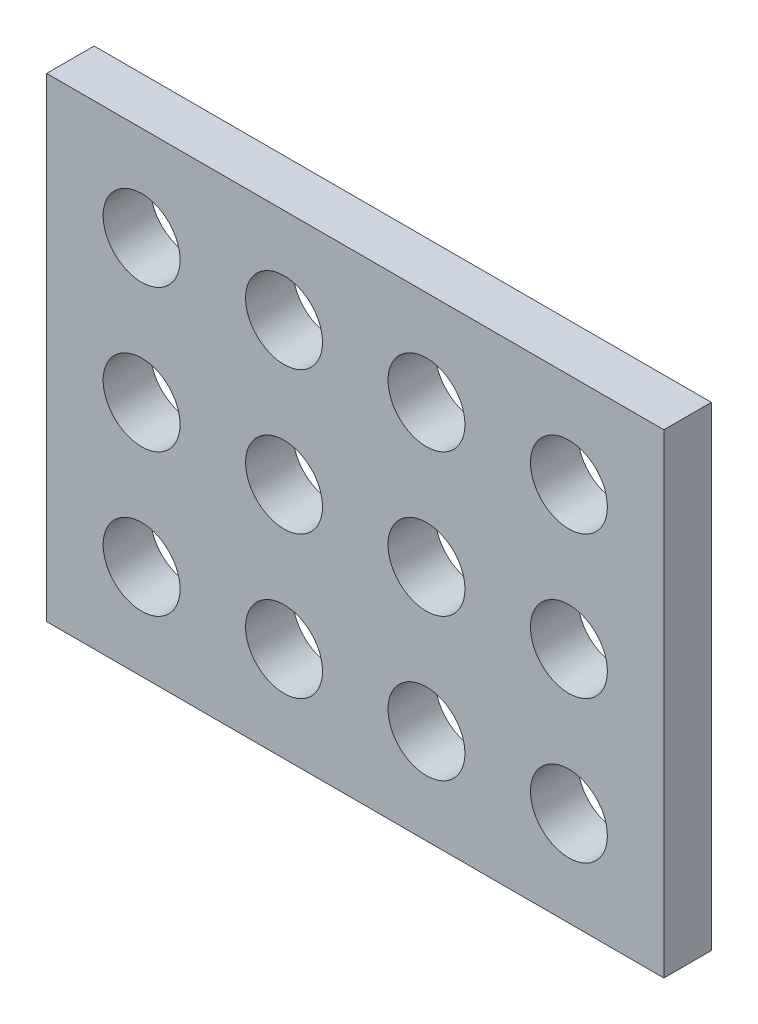
ISO-10303-21;
HEADER;
FILE_DESCRIPTION(('STEP AP214'),'2;1');
FILE_NAME('part.step','',(''),(''),'','','');
FILE_SCHEMA(('AUTOMOTIVE_DESIGN { 1 0 10303 214 1 1 1 1 }'));
ENDSEC;
DATA;
#1=APPLICATION_CONTEXT('core data for automotive mechanical design processes');
#2=APPLICATION_PROTOCOL_DEFINITION('international standard','automotive_design',2000,#1);
#3=PRODUCT_CONTEXT('',#1,'mechanical');
#4=PRODUCT('Part','Part','',(#3));
#5=PRODUCT_RELATED_PRODUCT_CATEGORY('part','',(#4));
#6=PRODUCT_DEFINITION_FORMATION('','',#4);
#7=PRODUCT_DEFINITION_CONTEXT('part definition',#1,'design');
#8=PRODUCT_DEFINITION('design','',#6,#7);
#9=PRODUCT_DEFINITION_SHAPE('','',#8);
#10=(LENGTH_UNIT() NAMED_UNIT(*) SI_UNIT(.MILLI.,.METRE.));
#11=(NAMED_UNIT(*) PLANE_ANGLE_UNIT() SI_UNIT($,.RADIAN.));
#12=(NAMED_UNIT(*) SI_UNIT($,.STERADIAN.) SOLID_ANGLE_UNIT());
#13=UNCERTAINTY_MEASURE_WITH_UNIT(LENGTH_MEASURE(1.E-05),#10,'distance_accuracy_value','');
#14=(GEOMETRIC_REPRESENTATION_CONTEXT(3) GLOBAL_UNCERTAINTY_ASSIGNED_CONTEXT((#13)) GLOBAL_UNIT_ASSIGNED_CONTEXT((#10,
#11,#12)) REPRESENTATION_CONTEXT('',''));
#15=CARTESIAN_POINT('',(0.,0.,0.));
#16=DIRECTION('',(0.,0.,1.));
#17=DIRECTION('',(1.,0.,0.));
#18=AXIS2_PLACEMENT_3D('',#15,#16,#17);
#19=CARTESIAN_POINT('',(0.,0.,10.));
#20=DIRECTION('',(0.,0.,-1.));
#21=DIRECTION('',(-1.,0.,0.));
#22=AXIS2_PLACEMENT_3D('',#19,#20,#21);
#23=PLANE('',#22);
#24=CARTESIAN_POINT('',(-44.9999999999997,0.,10.));
#25=DIRECTION('',(0.,0.,1.));
#26=DIRECTION('',(1.,0.,0.));
#27=AXIS2_PLACEMENT_3D('',#24,#25,#26);
#28=CIRCLE('',#27,8.1);
#29=CARTESIAN_POINT('',(-36.8999999999997,0.,10.));
#30=VERTEX_POINT('',#29);
#31=EDGE_CURVE('E168',#30,#30,#28,.T.);
#32=ORIENTED_EDGE('',*,*,#31,.F.);
#33=EDGE_LOOP('',(#32));
#34=FACE_BOUND('',#33,.T.);
#35=CARTESIAN_POINT('',(15.0000000000006,-30.,10.));
#36=DIRECTION('',(0.,0.,1.));
#37=DIRECTION('',(1.,0.,0.));
#38=AXIS2_PLACEMENT_3D('',#35,#36,#37);
#39=CIRCLE('',#38,8.09999999999999);
#40=CARTESIAN_POINT('',(23.1000000000006,-30.,10.));
#41=VERTEX_POINT('',#40);
#42=EDGE_CURVE('E156',#41,#41,#39,.T.);
#43=ORIENTED_EDGE('',*,*,#42,.F.);
#44=EDGE_LOOP('',(#43));
#45=FACE_BOUND('',#44,.T.);
#46=CARTESIAN_POINT('',(45.0000000000003,0.,10.));
#47=DIRECTION('',(0.,0.,1.));
#48=DIRECTION('',(1.,0.,0.));
#49=AXIS2_PLACEMENT_3D('',#46,#47,#48);
#50=CIRCLE('',#49,8.1);
#51=CARTESIAN_POINT('',(53.1000000000003,0.,10.));
#52=VERTEX_POINT('',#51);
#53=EDGE_CURVE('E144',#52,#52,#50,.T.);
#54=ORIENTED_EDGE('',*,*,#53,.F.);
#55=EDGE_LOOP('',(#54));
#56=FACE_BOUND('',#55,.T.);
#57=CARTESIAN_POINT('',(-14.9999999999997,0.,10.));
#58=DIRECTION('',(0.,0.,1.));
#59=DIRECTION('',(1.,0.,0.));
#60=AXIS2_PLACEMENT_3D('',#57,#58,#59);
#61=CIRCLE('',#60,8.09999999999999);
#62=CARTESIAN_POINT('',(-6.89999999999968,0.,10.));
#63=VERTEX_POINT('',#62);
#64=EDGE_CURVE('E132',#63,#63,#61,.T.);
#65=ORIENTED_EDGE('',*,*,#64,.F.);
#66=EDGE_LOOP('',(#65));
#67=FACE_BOUND('',#66,.T.);
#68=CARTESIAN_POINT('',(15.,30.,10.));
#69=DIRECTION('',(0.,0.,1.));
#70=DIRECTION('',(1.,0.,0.));
#71=AXIS2_PLACEMENT_3D('',#68,#69,#70);
#72=CIRCLE('',#71,8.09999999999999);
#73=CARTESIAN_POINT('',(23.1,30.,10.));
#74=VERTEX_POINT('',#73);
#75=EDGE_CURVE('E120',#74,#74,#72,.T.);
#76=ORIENTED_EDGE('',*,*,#75,.F.);
#77=EDGE_LOOP('',(#76));
#78=FACE_BOUND('',#77,.T.);
#79=CARTESIAN_POINT('',(-45.,30.,10.));
#80=DIRECTION('',(0.,0.,1.));
#81=DIRECTION('',(1.,0.,0.));
#82=AXIS2_PLACEMENT_3D('',#79,#80,#81);
#83=CIRCLE('',#82,8.1);
#84=CARTESIAN_POINT('',(-36.9,30.,10.));
#85=VERTEX_POINT('',#84);
#86=EDGE_CURVE('E99',#85,#85,#83,.T.);
#87=ORIENTED_EDGE('',*,*,#86,.F.);
#88=EDGE_LOOP('',(#87));
#89=FACE_BOUND('',#88,.T.);
#90=DIRECTION('',(0.,1.,0.));
#91=VECTOR('',#90,1.);
#92=CARTESIAN_POINT('',(65.,-50.,10.));
#93=LINE('',#92,#91);
#94=CARTESIAN_POINT('',(65.,-50.,10.));
#95=VERTEX_POINT('',#94);
#96=CARTESIAN_POINT('',(65.,50.,10.));
#97=VERTEX_POINT('',#96);
#98=EDGE_CURVE('E84',#95,#97,#93,.T.);
#99=ORIENTED_EDGE('',*,*,#98,.T.);
#100=DIRECTION('',(-1.,0.,0.));
#101=VECTOR('',#100,1.);
#102=CARTESIAN_POINT('',(-65.,50.,10.));
#103=LINE('',#102,#101);
#104=CARTESIAN_POINT('',(-65.,50.,10.));
#105=VERTEX_POINT('',#104);
#106=EDGE_CURVE('E79',#97,#105,#103,.T.);
#107=ORIENTED_EDGE('',*,*,#106,.T.);
#108=DIRECTION('',(0.,-1.,0.));
#109=VECTOR('',#108,1.);
#110=CARTESIAN_POINT('',(-65.,-50.,10.));
#111=LINE('',#110,#109);
#112=CARTESIAN_POINT('',(-65.,-50.,10.));
#113=VERTEX_POINT('',#112);
#114=EDGE_CURVE('E82',#105,#113,#111,.T.);
#115=ORIENTED_EDGE('',*,*,#114,.T.);
#116=DIRECTION('',(1.,0.,0.));
#117=VECTOR('',#116,1.);
#118=CARTESIAN_POINT('',(-65.,-50.,10.));
#119=LINE('',#118,#117);
#120=EDGE_CURVE('E49',#113,#95,#119,.T.);
#121=ORIENTED_EDGE('',*,*,#120,.T.);
#122=EDGE_LOOP('',(#99,#107,#115,#121));
#123=FACE_BOUND('',#122,.T.);
#124=CARTESIAN_POINT('',(-15.,30.,10.));
#125=DIRECTION('',(0.,0.,1.));
#126=DIRECTION('',(1.,0.,0.));
#127=AXIS2_PLACEMENT_3D('',#124,#125,#126);
#128=CIRCLE('',#127,8.1);
#129=CARTESIAN_POINT('',(-6.89999999999999,30.,10.));
#130=VERTEX_POINT('',#129);
#131=EDGE_CURVE('E114',#130,#130,#128,.T.);
#132=ORIENTED_EDGE('',*,*,#131,.F.);
#133=EDGE_LOOP('',(#132));
#134=FACE_BOUND('',#133,.T.);
#135=CARTESIAN_POINT('',(45.,30.,10.));
#136=DIRECTION('',(0.,0.,1.));
#137=DIRECTION('',(1.,0.,0.));
#138=AXIS2_PLACEMENT_3D('',#135,#136,#137);
#139=CIRCLE('',#138,8.1);
#140=CARTESIAN_POINT('',(53.1,30.,10.));
#141=VERTEX_POINT('',#140);
#142=EDGE_CURVE('E126',#141,#141,#139,.T.);
#143=ORIENTED_EDGE('',*,*,#142,.F.);
#144=EDGE_LOOP('',(#143));
#145=FACE_BOUND('',#144,.T.);
#146=CARTESIAN_POINT('',(15.0000000000003,0.,10.));
#147=DIRECTION('',(0.,0.,1.));
#148=DIRECTION('',(1.,0.,0.));
#149=AXIS2_PLACEMENT_3D('',#146,#147,#148);
#150=CIRCLE('',#149,8.09999999999999);
#151=CARTESIAN_POINT('',(23.1000000000003,0.,10.));
#152=VERTEX_POINT('',#151);
#153=EDGE_CURVE('E138',#152,#152,#150,.T.);
#154=ORIENTED_EDGE('',*,*,#153,.F.);
#155=EDGE_LOOP('',(#154));
#156=FACE_BOUND('',#155,.T.);
#157=CARTESIAN_POINT('',(-14.9999999999994,-30.,10.));
#158=DIRECTION('',(0.,0.,1.));
#159=DIRECTION('',(1.,0.,0.));
#160=AXIS2_PLACEMENT_3D('',#157,#158,#159);
#161=CIRCLE('',#160,8.09999999999999);
#162=CARTESIAN_POINT('',(-6.89999999999937,-30.,10.));
#163=VERTEX_POINT('',#162);
#164=EDGE_CURVE('E150',#163,#163,#161,.T.);
#165=ORIENTED_EDGE('',*,*,#164,.F.);
#166=EDGE_LOOP('',(#165));
#167=FACE_BOUND('',#166,.T.);
#168=CARTESIAN_POINT('',(45.0000000000006,-30.,10.));
#169=DIRECTION('',(0.,0.,1.));
#170=DIRECTION('',(1.,0.,0.));
#171=AXIS2_PLACEMENT_3D('',#168,#169,#170);
#172=CIRCLE('',#171,8.1);
#173=CARTESIAN_POINT('',(53.1000000000006,-30.,10.));
#174=VERTEX_POINT('',#173);
#175=EDGE_CURVE('E162',#174,#174,#172,.T.);
#176=ORIENTED_EDGE('',*,*,#175,.F.);
#177=EDGE_LOOP('',(#176));
#178=FACE_BOUND('',#177,.T.);
#179=CARTESIAN_POINT('',(-44.9999999999994,-30.,10.));
#180=DIRECTION('',(0.,0.,1.));
#181=DIRECTION('',(1.,0.,0.));
#182=AXIS2_PLACEMENT_3D('',#179,#180,#181);
#183=CIRCLE('',#182,8.1);
#184=CARTESIAN_POINT('',(-36.8999999999994,-30.,10.));
#185=VERTEX_POINT('',#184);
#186=EDGE_CURVE('E174',#185,#185,#183,.T.);
#187=ORIENTED_EDGE('',*,*,#186,.F.);
#188=EDGE_LOOP('',(#187));
#189=FACE_BOUND('',#188,.T.);
#190=ADVANCED_FACE('F32',(#34,#45,#56,#67,#78,#89,#123,#134,#145,#156,#167,#178,#189),#23,.F.);
#191=CARTESIAN_POINT('',(0.,0.,0.));
#192=DIRECTION('',(0.,0.,-1.));
#193=DIRECTION('',(-1.,0.,0.));
#194=AXIS2_PLACEMENT_3D('',#191,#192,#193);
#195=PLANE('',#194);
#196=CARTESIAN_POINT('',(-44.9999999999997,0.,0.));
#197=DIRECTION('',(0.,0.,1.));
#198=DIRECTION('',(1.,0.,0.));
#199=AXIS2_PLACEMENT_3D('',#196,#197,#198);
#200=CIRCLE('',#199,8.1);
#201=CARTESIAN_POINT('',(-36.8999999999997,0.,0.));
#202=VERTEX_POINT('',#201);
#203=EDGE_CURVE('E171',#202,#202,#200,.T.);
#204=ORIENTED_EDGE('',*,*,#203,.T.);
#205=EDGE_LOOP('',(#204));
#206=FACE_BOUND('',#205,.T.);
#207=CARTESIAN_POINT('',(15.0000000000006,-30.,0.));
#208=DIRECTION('',(0.,0.,1.));
#209=DIRECTION('',(1.,0.,0.));
#210=AXIS2_PLACEMENT_3D('',#207,#208,#209);
#211=CIRCLE('',#210,8.09999999999999);
#212=CARTESIAN_POINT('',(23.1000000000006,-30.,0.));
#213=VERTEX_POINT('',#212);
#214=EDGE_CURVE('E159',#213,#213,#211,.T.);
#215=ORIENTED_EDGE('',*,*,#214,.T.);
#216=EDGE_LOOP('',(#215));
#217=FACE_BOUND('',#216,.T.);
#218=CARTESIAN_POINT('',(45.0000000000003,0.,0.));
#219=DIRECTION('',(0.,0.,1.));
#220=DIRECTION('',(1.,0.,0.));
#221=AXIS2_PLACEMENT_3D('',#218,#219,#220);
#222=CIRCLE('',#221,8.1);
#223=CARTESIAN_POINT('',(53.1000000000003,0.,0.));
#224=VERTEX_POINT('',#223);
#225=EDGE_CURVE('E147',#224,#224,#222,.T.);
#226=ORIENTED_EDGE('',*,*,#225,.T.);
#227=EDGE_LOOP('',(#226));
#228=FACE_BOUND('',#227,.T.);
#229=CARTESIAN_POINT('',(-14.9999999999997,0.,0.));
#230=DIRECTION('',(0.,0.,1.));
#231=DIRECTION('',(1.,0.,0.));
#232=AXIS2_PLACEMENT_3D('',#229,#230,#231);
#233=CIRCLE('',#232,8.09999999999999);
#234=CARTESIAN_POINT('',(-6.89999999999968,0.,0.));
#235=VERTEX_POINT('',#234);
#236=EDGE_CURVE('E135',#235,#235,#233,.T.);
#237=ORIENTED_EDGE('',*,*,#236,.T.);
#238=EDGE_LOOP('',(#237));
#239=FACE_BOUND('',#238,.T.);
#240=CARTESIAN_POINT('',(15.,30.,0.));
#241=DIRECTION('',(0.,0.,1.));
#242=DIRECTION('',(1.,0.,0.));
#243=AXIS2_PLACEMENT_3D('',#240,#241,#242);
#244=CIRCLE('',#243,8.09999999999999);
#245=CARTESIAN_POINT('',(23.1,30.,0.));
#246=VERTEX_POINT('',#245);
#247=EDGE_CURVE('E123',#246,#246,#244,.T.);
#248=ORIENTED_EDGE('',*,*,#247,.T.);
#249=EDGE_LOOP('',(#248));
#250=FACE_BOUND('',#249,.T.);
#251=CARTESIAN_POINT('',(-45.,30.,0.));
#252=DIRECTION('',(0.,0.,1.));
#253=DIRECTION('',(1.,0.,0.));
#254=AXIS2_PLACEMENT_3D('',#251,#252,#253);
#255=CIRCLE('',#254,8.1);
#256=CARTESIAN_POINT('',(-36.9,30.,0.));
#257=VERTEX_POINT('',#256);
#258=EDGE_CURVE('E111',#257,#257,#255,.T.);
#259=ORIENTED_EDGE('',*,*,#258,.T.);
#260=EDGE_LOOP('',(#259));
#261=FACE_BOUND('',#260,.T.);
#262=DIRECTION('',(0.,1.,0.));
#263=VECTOR('',#262,1.);
#264=CARTESIAN_POINT('',(65.,-50.,0.));
#265=LINE('',#264,#263);
#266=CARTESIAN_POINT('',(65.,-50.,0.));
#267=VERTEX_POINT('',#266);
#268=CARTESIAN_POINT('',(65.,50.,0.));
#269=VERTEX_POINT('',#268);
#270=EDGE_CURVE('E96',#267,#269,#265,.T.);
#271=ORIENTED_EDGE('',*,*,#270,.F.);
#272=DIRECTION('',(1.,0.,0.));
#273=VECTOR('',#272,1.);
#274=CARTESIAN_POINT('',(-65.,-50.,0.));
#275=LINE('',#274,#273);
#276=CARTESIAN_POINT('',(-65.,-50.,0.));
#277=VERTEX_POINT('',#276);
#278=EDGE_CURVE('E72',#277,#267,#275,.T.);
#279=ORIENTED_EDGE('',*,*,#278,.F.);
#280=DIRECTION('',(0.,-1.,0.));
#281=VECTOR('',#280,1.);
#282=CARTESIAN_POINT('',(-65.,-50.,0.));
#283=LINE('',#282,#281);
#284=CARTESIAN_POINT('',(-65.,50.,0.));
#285=VERTEX_POINT('',#284);
#286=EDGE_CURVE('E66',#285,#277,#283,.T.);
#287=ORIENTED_EDGE('',*,*,#286,.F.);
#288=DIRECTION('',(-1.,0.,0.));
#289=VECTOR('',#288,1.);
#290=CARTESIAN_POINT('',(-65.,50.,0.));
#291=LINE('',#290,#289);
#292=EDGE_CURVE('E88',#269,#285,#291,.T.);
#293=ORIENTED_EDGE('',*,*,#292,.F.);
#294=EDGE_LOOP('',(#271,#279,#287,#293));
#295=FACE_BOUND('',#294,.T.);
#296=CARTESIAN_POINT('',(-15.,30.,0.));
#297=DIRECTION('',(0.,0.,1.));
#298=DIRECTION('',(1.,0.,0.));
#299=AXIS2_PLACEMENT_3D('',#296,#297,#298);
#300=CIRCLE('',#299,8.1);
#301=CARTESIAN_POINT('',(-6.89999999999999,30.,0.));
#302=VERTEX_POINT('',#301);
#303=EDGE_CURVE('E117',#302,#302,#300,.T.);
#304=ORIENTED_EDGE('',*,*,#303,.T.);
#305=EDGE_LOOP('',(#304));
#306=FACE_BOUND('',#305,.T.);
#307=CARTESIAN_POINT('',(45.,30.,0.));
#308=DIRECTION('',(0.,0.,1.));
#309=DIRECTION('',(1.,0.,0.));
#310=AXIS2_PLACEMENT_3D('',#307,#308,#309);
#311=CIRCLE('',#310,8.1);
#312=CARTESIAN_POINT('',(53.1,30.,0.));
#313=VERTEX_POINT('',#312);
#314=EDGE_CURVE('E129',#313,#313,#311,.T.);
#315=ORIENTED_EDGE('',*,*,#314,.T.);
#316=EDGE_LOOP('',(#315));
#317=FACE_BOUND('',#316,.T.);
#318=CARTESIAN_POINT('',(15.0000000000003,0.,0.));
#319=DIRECTION('',(0.,0.,1.));
#320=DIRECTION('',(1.,0.,0.));
#321=AXIS2_PLACEMENT_3D('',#318,#319,#320);
#322=CIRCLE('',#321,8.09999999999999);
#323=CARTESIAN_POINT('',(23.1000000000003,0.,0.));
#324=VERTEX_POINT('',#323);
#325=EDGE_CURVE('E141',#324,#324,#322,.T.);
#326=ORIENTED_EDGE('',*,*,#325,.T.);
#327=EDGE_LOOP('',(#326));
#328=FACE_BOUND('',#327,.T.);
#329=CARTESIAN_POINT('',(-14.9999999999994,-30.,0.));
#330=DIRECTION('',(0.,0.,1.));
#331=DIRECTION('',(1.,0.,0.));
#332=AXIS2_PLACEMENT_3D('',#329,#330,#331);
#333=CIRCLE('',#332,8.09999999999999);
#334=CARTESIAN_POINT('',(-6.89999999999937,-30.,0.));
#335=VERTEX_POINT('',#334);
#336=EDGE_CURVE('E153',#335,#335,#333,.T.);
#337=ORIENTED_EDGE('',*,*,#336,.T.);
#338=EDGE_LOOP('',(#337));
#339=FACE_BOUND('',#338,.T.);
#340=CARTESIAN_POINT('',(45.0000000000006,-30.,0.));
#341=DIRECTION('',(0.,0.,1.));
#342=DIRECTION('',(1.,0.,0.));
#343=AXIS2_PLACEMENT_3D('',#340,#341,#342);
#344=CIRCLE('',#343,8.1);
#345=CARTESIAN_POINT('',(53.1000000000006,-30.,0.));
#346=VERTEX_POINT('',#345);
#347=EDGE_CURVE('E165',#346,#346,#344,.T.);
#348=ORIENTED_EDGE('',*,*,#347,.T.);
#349=EDGE_LOOP('',(#348));
#350=FACE_BOUND('',#349,.T.);
#351=CARTESIAN_POINT('',(-44.9999999999994,-30.,0.));
#352=DIRECTION('',(0.,0.,1.));
#353=DIRECTION('',(1.,0.,0.));
#354=AXIS2_PLACEMENT_3D('',#351,#352,#353);
#355=CIRCLE('',#354,8.1);
#356=CARTESIAN_POINT('',(-36.8999999999994,-30.,0.));
#357=VERTEX_POINT('',#356);
#358=EDGE_CURVE('E177',#357,#357,#355,.T.);
#359=ORIENTED_EDGE('',*,*,#358,.T.);
#360=EDGE_LOOP('',(#359));
#361=FACE_BOUND('',#360,.T.);
#362=ADVANCED_FACE('F107',(#206,#217,#228,#239,#250,#261,#295,#306,#317,#328,#339,#350,#361),
#195,.T.);
#363=CARTESIAN_POINT('',(65.,-50.,10.));
#364=DIRECTION('',(-1.,0.,0.));
#365=DIRECTION('',(0.,0.,1.));
#366=AXIS2_PLACEMENT_3D('',#363,#364,#365);
#367=PLANE('',#366);
#368=ORIENTED_EDGE('',*,*,#270,.T.);
#369=DIRECTION('',(0.,0.,-1.));
#370=VECTOR('',#369,1.);
#371=CARTESIAN_POINT('',(65.,50.,10.));
#372=LINE('',#371,#370);
#373=EDGE_CURVE('E11',#97,#269,#372,.T.);
#374=ORIENTED_EDGE('',*,*,#373,.F.);
#375=ORIENTED_EDGE('',*,*,#98,.F.);
#376=DIRECTION('',(0.,0.,-1.));
#377=VECTOR('',#376,1.);
#378=CARTESIAN_POINT('',(65.,-50.,10.));
#379=LINE('',#378,#377);
#380=EDGE_CURVE('E92',#95,#267,#379,.T.);
#381=ORIENTED_EDGE('',*,*,#380,.T.);
#382=EDGE_LOOP('',(#368,#374,#375,#381));
#383=FACE_BOUND('',#382,.T.);
#384=ADVANCED_FACE('F34',(#383),#367,.F.);
#385=CARTESIAN_POINT('',(-65.,50.,10.));
#386=DIRECTION('',(0.,-1.,0.));
#387=DIRECTION('',(0.,0.,-1.));
#388=AXIS2_PLACEMENT_3D('',#385,#386,#387);
#389=PLANE('',#388);
#390=ORIENTED_EDGE('',*,*,#292,.T.);
#391=DIRECTION('',(0.,0.,-1.));
#392=VECTOR('',#391,1.);
#393=CARTESIAN_POINT('',(-65.,50.,10.));
#394=LINE('',#393,#392);
#395=EDGE_CURVE('E41',#105,#285,#394,.T.);
#396=ORIENTED_EDGE('',*,*,#395,.F.);
#397=ORIENTED_EDGE('',*,*,#106,.F.);
#398=ORIENTED_EDGE('',*,*,#373,.T.);
#399=EDGE_LOOP('',(#390,#396,#397,#398));
#400=FACE_BOUND('',#399,.T.);
#401=ADVANCED_FACE('F87',(#400),#389,.F.);
#402=CARTESIAN_POINT('',(-65.,-50.,10.));
#403=DIRECTION('',(1.,0.,0.));
#404=DIRECTION('',(0.,0.,-1.));
#405=AXIS2_PLACEMENT_3D('',#402,#403,#404);
#406=PLANE('',#405);
#407=ORIENTED_EDGE('',*,*,#286,.T.);
#408=DIRECTION('',(0.,0.,-1.));
#409=VECTOR('',#408,1.);
#410=CARTESIAN_POINT('',(-65.,-50.,10.));
#411=LINE('',#410,#409);
#412=EDGE_CURVE('E89',#113,#277,#411,.T.);
#413=ORIENTED_EDGE('',*,*,#412,.F.);
#414=ORIENTED_EDGE('',*,*,#114,.F.);
#415=ORIENTED_EDGE('',*,*,#395,.T.);
#416=EDGE_LOOP('',(#407,#413,#414,#415));
#417=FACE_BOUND('',#416,.T.);
#418=ADVANCED_FACE('F90',(#417),#406,.F.);
#419=CARTESIAN_POINT('',(-65.,-50.,10.));
#420=DIRECTION('',(0.,1.,0.));
#421=DIRECTION('',(0.,0.,1.));
#422=AXIS2_PLACEMENT_3D('',#419,#420,#421);
#423=PLANE('',#422);
#424=ORIENTED_EDGE('',*,*,#278,.T.);
#425=ORIENTED_EDGE('',*,*,#380,.F.);
#426=ORIENTED_EDGE('',*,*,#120,.F.);
#427=ORIENTED_EDGE('',*,*,#412,.T.);
#428=EDGE_LOOP('',(#424,#425,#426,#427));
#429=FACE_BOUND('',#428,.T.);
#430=ADVANCED_FACE('F104',(#429),#423,.F.);
#431=CARTESIAN_POINT('',(-45.,30.,10.));
#432=DIRECTION('',(0.,0.,-1.));
#433=DIRECTION('',(-1.,0.,0.));
#434=AXIS2_PLACEMENT_3D('',#431,#432,#433);
#435=CYLINDRICAL_SURFACE('',#434,8.1);
#436=ORIENTED_EDGE('',*,*,#86,.T.);
#437=EDGE_LOOP('',(#436));
#438=FACE_BOUND('',#437,.T.);
#439=ORIENTED_EDGE('',*,*,#258,.F.);
#440=EDGE_LOOP('',(#439));
#441=FACE_BOUND('',#440,.T.);
#442=ADVANCED_FACE('F197',(#438,#441),#435,.F.);
#443=CARTESIAN_POINT('',(-15.,30.,10.));
#444=DIRECTION('',(0.,0.,-1.));
#445=DIRECTION('',(-1.,0.,0.));
#446=AXIS2_PLACEMENT_3D('',#443,#444,#445);
#447=CYLINDRICAL_SURFACE('',#446,8.1);
#448=ORIENTED_EDGE('',*,*,#131,.T.);
#449=EDGE_LOOP('',(#448));
#450=FACE_BOUND('',#449,.T.);
#451=ORIENTED_EDGE('',*,*,#303,.F.);
#452=EDGE_LOOP('',(#451));
#453=FACE_BOUND('',#452,.T.);
#454=ADVANCED_FACE('F243',(#450,#453),#447,.F.);
#455=CARTESIAN_POINT('',(15.,30.,10.));
#456=DIRECTION('',(0.,0.,-1.));
#457=DIRECTION('',(-1.,0.,0.));
#458=AXIS2_PLACEMENT_3D('',#455,#456,#457);
#459=CYLINDRICAL_SURFACE('',#458,8.09999999999999);
#460=ORIENTED_EDGE('',*,*,#75,.T.);
#461=EDGE_LOOP('',(#460));
#462=FACE_BOUND('',#461,.T.);
#463=ORIENTED_EDGE('',*,*,#247,.F.);
#464=EDGE_LOOP('',(#463));
#465=FACE_BOUND('',#464,.T.);
#466=ADVANCED_FACE('F251',(#462,#465),#459,.F.);
#467=CARTESIAN_POINT('',(45.,30.,10.));
#468=DIRECTION('',(0.,0.,-1.));
#469=DIRECTION('',(-1.,0.,0.));
#470=AXIS2_PLACEMENT_3D('',#467,#468,#469);
#471=CYLINDRICAL_SURFACE('',#470,8.1);
#472=ORIENTED_EDGE('',*,*,#142,.T.);
#473=EDGE_LOOP('',(#472));
#474=FACE_BOUND('',#473,.T.);
#475=ORIENTED_EDGE('',*,*,#314,.F.);
#476=EDGE_LOOP('',(#475));
#477=FACE_BOUND('',#476,.T.);
#478=ADVANCED_FACE('F259',(#474,#477),#471,.F.);
#479=CARTESIAN_POINT('',(-14.9999999999997,0.,10.));
#480=DIRECTION('',(0.,0.,-1.));
#481=DIRECTION('',(-1.,0.,0.));
#482=AXIS2_PLACEMENT_3D('',#479,#480,#481);
#483=CYLINDRICAL_SURFACE('',#482,8.09999999999999);
#484=ORIENTED_EDGE('',*,*,#64,.T.);
#485=EDGE_LOOP('',(#484));
#486=FACE_BOUND('',#485,.T.);
#487=ORIENTED_EDGE('',*,*,#236,.F.);
#488=EDGE_LOOP('',(#487));
#489=FACE_BOUND('',#488,.T.);
#490=ADVANCED_FACE('F268',(#486,#489),#483,.F.);
#491=CARTESIAN_POINT('',(15.0000000000003,0.,10.));
#492=DIRECTION('',(0.,0.,-1.));
#493=DIRECTION('',(-1.,0.,0.));
#494=AXIS2_PLACEMENT_3D('',#491,#492,#493);
#495=CYLINDRICAL_SURFACE('',#494,8.09999999999999);
#496=ORIENTED_EDGE('',*,*,#153,.T.);
#497=EDGE_LOOP('',(#496));
#498=FACE_BOUND('',#497,.T.);
#499=ORIENTED_EDGE('',*,*,#325,.F.);
#500=EDGE_LOOP('',(#499));
#501=FACE_BOUND('',#500,.T.);
#502=ADVANCED_FACE('F277',(#498,#501),#495,.F.);
#503=CARTESIAN_POINT('',(45.0000000000003,0.,10.));
#504=DIRECTION('',(0.,0.,-1.));
#505=DIRECTION('',(-1.,0.,0.));
#506=AXIS2_PLACEMENT_3D('',#503,#504,#505);
#507=CYLINDRICAL_SURFACE('',#506,8.1);
#508=ORIENTED_EDGE('',*,*,#53,.T.);
#509=EDGE_LOOP('',(#508));
#510=FACE_BOUND('',#509,.T.);
#511=ORIENTED_EDGE('',*,*,#225,.F.);
#512=EDGE_LOOP('',(#511));
#513=FACE_BOUND('',#512,.T.);
#514=ADVANCED_FACE('F286',(#510,#513),#507,.F.);
#515=CARTESIAN_POINT('',(-14.9999999999994,-30.,10.));
#516=DIRECTION('',(0.,0.,-1.));
#517=DIRECTION('',(-1.,0.,0.));
#518=AXIS2_PLACEMENT_3D('',#515,#516,#517);
#519=CYLINDRICAL_SURFACE('',#518,8.09999999999999);
#520=ORIENTED_EDGE('',*,*,#164,.T.);
#521=EDGE_LOOP('',(#520));
#522=FACE_BOUND('',#521,.T.);
#523=ORIENTED_EDGE('',*,*,#336,.F.);
#524=EDGE_LOOP('',(#523));
#525=FACE_BOUND('',#524,.T.);
#526=ADVANCED_FACE('F295',(#522,#525),#519,.F.);
#527=CARTESIAN_POINT('',(15.0000000000006,-30.,10.));
#528=DIRECTION('',(0.,0.,-1.));
#529=DIRECTION('',(-1.,0.,0.));
#530=AXIS2_PLACEMENT_3D('',#527,#528,#529);
#531=CYLINDRICAL_SURFACE('',#530,8.09999999999999);
#532=ORIENTED_EDGE('',*,*,#42,.T.);
#533=EDGE_LOOP('',(#532));
#534=FACE_BOUND('',#533,.T.);
#535=ORIENTED_EDGE('',*,*,#214,.F.);
#536=EDGE_LOOP('',(#535));
#537=FACE_BOUND('',#536,.T.);
#538=ADVANCED_FACE('F304',(#534,#537),#531,.F.);
#539=CARTESIAN_POINT('',(45.0000000000006,-30.,10.));
#540=DIRECTION('',(0.,0.,-1.));
#541=DIRECTION('',(-1.,0.,0.));
#542=AXIS2_PLACEMENT_3D('',#539,#540,#541);
#543=CYLINDRICAL_SURFACE('',#542,8.1);
#544=ORIENTED_EDGE('',*,*,#175,.T.);
#545=EDGE_LOOP('',(#544));
#546=FACE_BOUND('',#545,.T.);
#547=ORIENTED_EDGE('',*,*,#347,.F.);
#548=EDGE_LOOP('',(#547));
#549=FACE_BOUND('',#548,.T.);
#550=ADVANCED_FACE('F313',(#546,#549),#543,.F.);
#551=CARTESIAN_POINT('',(-44.9999999999997,0.,10.));
#552=DIRECTION('',(0.,0.,-1.));
#553=DIRECTION('',(-1.,0.,0.));
#554=AXIS2_PLACEMENT_3D('',#551,#552,#553);
#555=CYLINDRICAL_SURFACE('',#554,8.1);
#556=ORIENTED_EDGE('',*,*,#31,.T.);
#557=EDGE_LOOP('',(#556));
#558=FACE_BOUND('',#557,.T.);
#559=ORIENTED_EDGE('',*,*,#203,.F.);
#560=EDGE_LOOP('',(#559));
#561=FACE_BOUND('',#560,.T.);
#562=ADVANCED_FACE('F322',(#558,#561),#555,.F.);
#563=CARTESIAN_POINT('',(-44.9999999999994,-30.,10.));
#564=DIRECTION('',(0.,0.,-1.));
#565=DIRECTION('',(-1.,0.,0.));
#566=AXIS2_PLACEMENT_3D('',#563,#564,#565);
#567=CYLINDRICAL_SURFACE('',#566,8.1);
#568=ORIENTED_EDGE('',*,*,#186,.T.);
#569=EDGE_LOOP('',(#568));
#570=FACE_BOUND('',#569,.T.);
#571=ORIENTED_EDGE('',*,*,#358,.F.);
#572=EDGE_LOOP('',(#571));
#573=FACE_BOUND('',#572,.T.);
#574=ADVANCED_FACE('F183',(#570,#573),#567,.F.);
#575=CLOSED_SHELL('',(#190,#362,#384,#401,#418,#430,#442,#454,#466,#478,#490,#502,#514,#526,
#538,#550,#562,#574));
#576=MANIFOLD_SOLID_BREP('B2',#575);
#577=ADVANCED_BREP_SHAPE_REPRESENTATION('',(#18,#576),#14);
#578=SHAPE_DEFINITION_REPRESENTATION(#9,#577);
ENDSEC;
END-ISO-10303-21;
